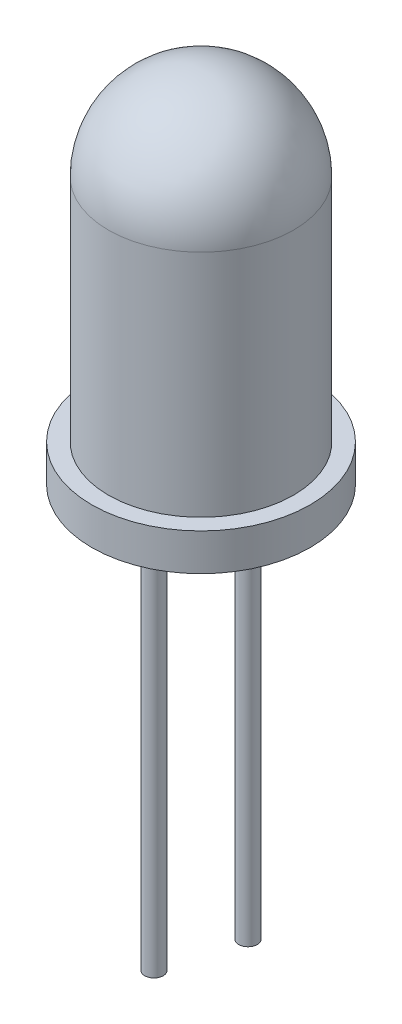
ISO-10303-21;
HEADER;
FILE_DESCRIPTION(('STEP AP214'),'2;1');
FILE_NAME('part.step','',(''),(''),'','','');
FILE_SCHEMA(('AUTOMOTIVE_DESIGN { 1 0 10303 214 1 1 1 1 }'));
ENDSEC;
DATA;
#1=APPLICATION_CONTEXT('core data for automotive mechanical design processes');
#2=APPLICATION_PROTOCOL_DEFINITION('international standard','automotive_design',2000,#1);
#3=PRODUCT_CONTEXT('',#1,'mechanical');
#4=PRODUCT('Part','Part','',(#3));
#5=PRODUCT_RELATED_PRODUCT_CATEGORY('part','',(#4));
#6=PRODUCT_DEFINITION_FORMATION('','',#4);
#7=PRODUCT_DEFINITION_CONTEXT('part definition',#1,'design');
#8=PRODUCT_DEFINITION('design','',#6,#7);
#9=PRODUCT_DEFINITION_SHAPE('','',#8);
#10=(LENGTH_UNIT() NAMED_UNIT(*) SI_UNIT(.MILLI.,.METRE.));
#11=(NAMED_UNIT(*) PLANE_ANGLE_UNIT() SI_UNIT($,.RADIAN.));
#12=(NAMED_UNIT(*) SI_UNIT($,.STERADIAN.) SOLID_ANGLE_UNIT());
#13=UNCERTAINTY_MEASURE_WITH_UNIT(LENGTH_MEASURE(1.E-05),#10,'distance_accuracy_value','');
#14=(GEOMETRIC_REPRESENTATION_CONTEXT(3) GLOBAL_UNCERTAINTY_ASSIGNED_CONTEXT((#13)) GLOBAL_UNIT_ASSIGNED_CONTEXT((#10,
#11,#12)) REPRESENTATION_CONTEXT('',''));
#15=CARTESIAN_POINT('',(0.,0.,0.));
#16=DIRECTION('',(0.,0.,1.));
#17=DIRECTION('',(1.,0.,0.));
#18=AXIS2_PLACEMENT_3D('',#15,#16,#17);
#19=CARTESIAN_POINT('',(2.95,0.,0.));
#20=DIRECTION('',(0.,-1.,0.));
#21=DIRECTION('',(0.,0.,-1.));
#22=AXIS2_PLACEMENT_3D('',#19,#20,#21);
#23=PLANE('',#22);
#24=CARTESIAN_POINT('',(-1.27,0.,0.));
#25=DIRECTION('',(0.,-1.,0.));
#26=DIRECTION('',(0.,0.,-1.));
#27=AXIS2_PLACEMENT_3D('',#24,#25,#26);
#28=CIRCLE('',#27,0.25);
#29=CARTESIAN_POINT('',(-1.27,0.,-0.25));
#30=VERTEX_POINT('',#29);
#31=EDGE_CURVE('E57',#30,#30,#28,.T.);
#32=ORIENTED_EDGE('',*,*,#31,.F.);
#33=EDGE_LOOP('',(#32));
#34=FACE_BOUND('',#33,.T.);
#35=CARTESIAN_POINT('',(1.27,0.,0.));
#36=DIRECTION('',(0.,-1.,0.));
#37=DIRECTION('',(0.,0.,-1.));
#38=AXIS2_PLACEMENT_3D('',#35,#36,#37);
#39=CIRCLE('',#38,0.25);
#40=CARTESIAN_POINT('',(1.27,0.,-0.25));
#41=VERTEX_POINT('',#40);
#42=EDGE_CURVE('E51',#41,#41,#39,.T.);
#43=ORIENTED_EDGE('',*,*,#42,.F.);
#44=EDGE_LOOP('',(#43));
#45=FACE_BOUND('',#44,.T.);
#46=CARTESIAN_POINT('',(0.,0.,0.));
#47=DIRECTION('',(0.,-1.,0.));
#48=DIRECTION('',(0.,0.,-1.));
#49=AXIS2_PLACEMENT_3D('',#46,#47,#48);
#50=CIRCLE('',#49,2.95);
#51=CARTESIAN_POINT('',(0.,0.,-2.95));
#52=VERTEX_POINT('',#51);
#53=EDGE_CURVE('E45',#52,#52,#50,.T.);
#54=ORIENTED_EDGE('',*,*,#53,.T.);
#55=EDGE_LOOP('',(#54));
#56=FACE_BOUND('',#55,.T.);
#57=ADVANCED_FACE('F31',(#34,#45,#56),#23,.T.);
#58=CARTESIAN_POINT('',(0.,7.2,0.));
#59=DIRECTION('',(0.,-1.,0.));
#60=DIRECTION('',(1.,0.,0.));
#61=AXIS2_PLACEMENT_3D('',#58,#59,#60);
#62=SPHERICAL_SURFACE('',#61,2.5);
#63=CARTESIAN_POINT('',(0.,7.2,0.));
#64=DIRECTION('',(0.,-1.,0.));
#65=DIRECTION('',(0.,0.,-1.));
#66=AXIS2_PLACEMENT_3D('',#63,#64,#65);
#67=CIRCLE('',#66,2.5);
#68=CARTESIAN_POINT('',(0.,7.2,-2.5));
#69=VERTEX_POINT('',#68);
#70=EDGE_CURVE('E10',#69,#69,#67,.T.);
#71=ORIENTED_EDGE('',*,*,#70,.F.);
#72=EDGE_LOOP('',(#71));
#73=FACE_BOUND('',#72,.T.);
#74=ADVANCED_FACE('F74',(#73),#62,.T.);
#75=CARTESIAN_POINT('',(0.,0.,0.));
#76=DIRECTION('',(0.,-1.,0.));
#77=DIRECTION('',(0.,0.,-1.));
#78=AXIS2_PLACEMENT_3D('',#75,#76,#77);
#79=CYLINDRICAL_SURFACE('',#78,2.5);
#80=ORIENTED_EDGE('',*,*,#70,.T.);
#81=EDGE_LOOP('',(#80));
#82=FACE_BOUND('',#81,.T.);
#83=CARTESIAN_POINT('',(0.,1.,0.));
#84=DIRECTION('',(0.,-1.,0.));
#85=DIRECTION('',(0.,0.,-1.));
#86=AXIS2_PLACEMENT_3D('',#83,#84,#85);
#87=CIRCLE('',#86,2.5);
#88=CARTESIAN_POINT('',(0.,1.,-2.5));
#89=VERTEX_POINT('',#88);
#90=EDGE_CURVE('E37',#89,#89,#87,.T.);
#91=ORIENTED_EDGE('',*,*,#90,.F.);
#92=EDGE_LOOP('',(#91));
#93=FACE_BOUND('',#92,.T.);
#94=ADVANCED_FACE('F91',(#82,#93),#79,.T.);
#95=CARTESIAN_POINT('',(2.5,1.,0.));
#96=DIRECTION('',(0.,1.,0.));
#97=DIRECTION('',(0.,0.,1.));
#98=AXIS2_PLACEMENT_3D('',#95,#96,#97);
#99=PLANE('',#98);
#100=ORIENTED_EDGE('',*,*,#90,.T.);
#101=EDGE_LOOP('',(#100));
#102=FACE_BOUND('',#101,.T.);
#103=CARTESIAN_POINT('',(0.,1.,0.));
#104=DIRECTION('',(0.,-1.,0.));
#105=DIRECTION('',(0.,0.,-1.));
#106=AXIS2_PLACEMENT_3D('',#103,#104,#105);
#107=CIRCLE('',#106,2.95);
#108=CARTESIAN_POINT('',(0.,1.,-2.95));
#109=VERTEX_POINT('',#108);
#110=EDGE_CURVE('E41',#109,#109,#107,.T.);
#111=ORIENTED_EDGE('',*,*,#110,.F.);
#112=EDGE_LOOP('',(#111));
#113=FACE_BOUND('',#112,.T.);
#114=ADVANCED_FACE('F82',(#102,#113),#99,.T.);
#115=CARTESIAN_POINT('',(0.,0.,0.));
#116=DIRECTION('',(0.,-1.,0.));
#117=DIRECTION('',(0.,0.,-1.));
#118=AXIS2_PLACEMENT_3D('',#115,#116,#117);
#119=CYLINDRICAL_SURFACE('',#118,2.95);
#120=ORIENTED_EDGE('',*,*,#110,.T.);
#121=EDGE_LOOP('',(#120));
#122=FACE_BOUND('',#121,.T.);
#123=ORIENTED_EDGE('',*,*,#53,.F.);
#124=EDGE_LOOP('',(#123));
#125=FACE_BOUND('',#124,.T.);
#126=ADVANCED_FACE('F79',(#122,#125),#119,.T.);
#127=CARTESIAN_POINT('',(1.27,-10.,0.));
#128=DIRECTION('',(0.,1.,0.));
#129=DIRECTION('',(0.,0.,1.));
#130=AXIS2_PLACEMENT_3D('',#127,#128,#129);
#131=CYLINDRICAL_SURFACE('',#130,0.25);
#132=CARTESIAN_POINT('',(1.27,-10.,0.));
#133=DIRECTION('',(0.,-1.,0.));
#134=DIRECTION('',(0.,0.,-1.));
#135=AXIS2_PLACEMENT_3D('',#132,#133,#134);
#136=CIRCLE('',#135,0.25);
#137=CARTESIAN_POINT('',(1.27,-10.,-0.25));
#138=VERTEX_POINT('',#137);
#139=EDGE_CURVE('E50',#138,#138,#136,.T.);
#140=ORIENTED_EDGE('',*,*,#139,.F.);
#141=EDGE_LOOP('',(#140));
#142=FACE_BOUND('',#141,.T.);
#143=ORIENTED_EDGE('',*,*,#42,.T.);
#144=EDGE_LOOP('',(#143));
#145=FACE_BOUND('',#144,.T.);
#146=ADVANCED_FACE('F81',(#142,#145),#131,.T.);
#147=CARTESIAN_POINT('',(1.27,-10.,0.));
#148=DIRECTION('',(0.,-1.,0.));
#149=DIRECTION('',(0.,0.,-1.));
#150=AXIS2_PLACEMENT_3D('',#147,#148,#149);
#151=PLANE('',#150);
#152=ORIENTED_EDGE('',*,*,#139,.T.);
#153=EDGE_LOOP('',(#152));
#154=FACE_BOUND('',#153,.T.);
#155=ADVANCED_FACE('F68',(#154),#151,.T.);
#156=CARTESIAN_POINT('',(-1.27,-12.,0.));
#157=DIRECTION('',(0.,1.,0.));
#158=DIRECTION('',(0.,0.,1.));
#159=AXIS2_PLACEMENT_3D('',#156,#157,#158);
#160=CYLINDRICAL_SURFACE('',#159,0.25);
#161=CARTESIAN_POINT('',(-1.27,-12.,0.));
#162=DIRECTION('',(0.,-1.,0.));
#163=DIRECTION('',(0.,0.,-1.));
#164=AXIS2_PLACEMENT_3D('',#161,#162,#163);
#165=CIRCLE('',#164,0.25);
#166=CARTESIAN_POINT('',(-1.27,-12.,-0.25));
#167=VERTEX_POINT('',#166);
#168=EDGE_CURVE('E54',#167,#167,#165,.T.);
#169=ORIENTED_EDGE('',*,*,#168,.F.);
#170=EDGE_LOOP('',(#169));
#171=FACE_BOUND('',#170,.T.);
#172=ORIENTED_EDGE('',*,*,#31,.T.);
#173=EDGE_LOOP('',(#172));
#174=FACE_BOUND('',#173,.T.);
#175=ADVANCED_FACE('F65',(#171,#174),#160,.T.);
#176=CARTESIAN_POINT('',(-1.27,-12.,0.));
#177=DIRECTION('',(0.,-1.,0.));
#178=DIRECTION('',(0.,0.,-1.));
#179=AXIS2_PLACEMENT_3D('',#176,#177,#178);
#180=PLANE('',#179);
#181=ORIENTED_EDGE('',*,*,#168,.T.);
#182=EDGE_LOOP('',(#181));
#183=FACE_BOUND('',#182,.T.);
#184=ADVANCED_FACE('F63',(#183),#180,.T.);
#185=CLOSED_SHELL('',(#57,#74,#94,#114,#126,#146,#155,#175,#184));
#186=MANIFOLD_SOLID_BREP('B2',#185);
#187=ADVANCED_BREP_SHAPE_REPRESENTATION('',(#18,#186),#14);
#188=SHAPE_DEFINITION_REPRESENTATION(#9,#187);
ENDSEC;
END-ISO-10303-21;
